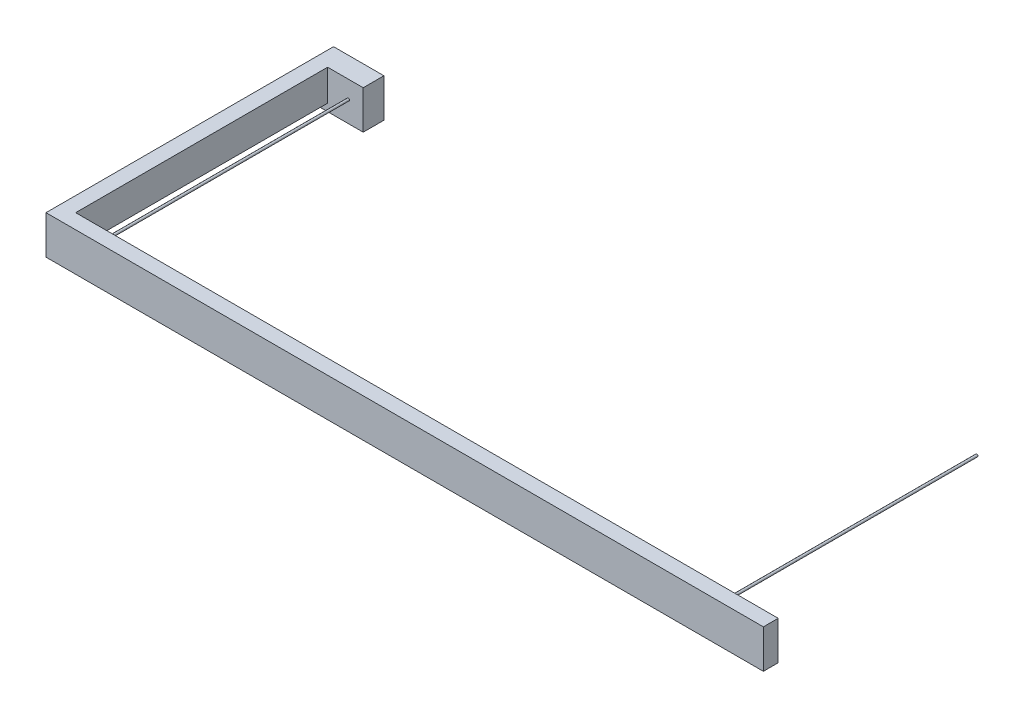
ISO-10303-21;
HEADER;
FILE_DESCRIPTION(('STEP AP214'),'2;1');
FILE_NAME('part.step','',(''),(''),'','','');
FILE_SCHEMA(('AUTOMOTIVE_DESIGN { 1 0 10303 214 1 1 1 1 }'));
ENDSEC;
DATA;
#1=APPLICATION_CONTEXT('core data for automotive mechanical design processes');
#2=APPLICATION_PROTOCOL_DEFINITION('international standard','automotive_design',2000,#1);
#3=PRODUCT_CONTEXT('',#1,'mechanical');
#4=PRODUCT('Part','Part','',(#3));
#5=PRODUCT_RELATED_PRODUCT_CATEGORY('part','',(#4));
#6=PRODUCT_DEFINITION_FORMATION('','',#4);
#7=PRODUCT_DEFINITION_CONTEXT('part definition',#1,'design');
#8=PRODUCT_DEFINITION('design','',#6,#7);
#9=PRODUCT_DEFINITION_SHAPE('','',#8);
#10=(LENGTH_UNIT() NAMED_UNIT(*) SI_UNIT(.MILLI.,.METRE.));
#11=(NAMED_UNIT(*) PLANE_ANGLE_UNIT() SI_UNIT($,.RADIAN.));
#12=(NAMED_UNIT(*) SI_UNIT($,.STERADIAN.) SOLID_ANGLE_UNIT());
#13=UNCERTAINTY_MEASURE_WITH_UNIT(LENGTH_MEASURE(1.E-05),#10,'distance_accuracy_value','');
#14=(GEOMETRIC_REPRESENTATION_CONTEXT(3) GLOBAL_UNCERTAINTY_ASSIGNED_CONTEXT((#13)) GLOBAL_UNIT_ASSIGNED_CONTEXT((#10,
#11,#12)) REPRESENTATION_CONTEXT('',''));
#15=CARTESIAN_POINT('',(0.,0.,0.));
#16=DIRECTION('',(0.,0.,1.));
#17=DIRECTION('',(1.,0.,0.));
#18=AXIS2_PLACEMENT_3D('',#15,#16,#17);
#19=CARTESIAN_POINT('',(0.,0.,5.));
#20=DIRECTION('',(0.,1.,0.));
#21=DIRECTION('',(0.,0.,1.));
#22=AXIS2_PLACEMENT_3D('',#19,#20,#21);
#23=PLANE('',#22);
#24=DIRECTION('',(0.,0.,1.));
#25=VECTOR('',#24,1.);
#26=CARTESIAN_POINT('',(-217.,0.,0.));
#27=LINE('',#26,#25);
#28=CARTESIAN_POINT('',(-217.,0.,0.));
#29=VERTEX_POINT('',#28);
#30=CARTESIAN_POINT('',(-217.,0.,5.));
#31=VERTEX_POINT('',#30);
#32=EDGE_CURVE('E133',#29,#31,#27,.T.);
#33=ORIENTED_EDGE('',*,*,#32,.F.);
#34=DIRECTION('',(1.,0.,0.));
#35=VECTOR('',#34,1.);
#36=CARTESIAN_POINT('',(0.,0.,0.));
#37=LINE('',#36,#35);
#38=CARTESIAN_POINT('',(25.,0.,0.));
#39=VERTEX_POINT('',#38);
#40=EDGE_CURVE('E67',#29,#39,#37,.T.);
#41=ORIENTED_EDGE('',*,*,#40,.T.);
#42=DIRECTION('',(0.,0.,-1.));
#43=VECTOR('',#42,1.);
#44=CARTESIAN_POINT('',(25.,0.,5.));
#45=LINE('',#44,#43);
#46=CARTESIAN_POINT('',(25.,0.,5.));
#47=VERTEX_POINT('',#46);
#48=EDGE_CURVE('E11',#47,#39,#45,.T.);
#49=ORIENTED_EDGE('',*,*,#48,.F.);
#50=DIRECTION('',(1.,0.,0.));
#51=VECTOR('',#50,1.);
#52=CARTESIAN_POINT('',(0.,0.,5.));
#53=LINE('',#52,#51);
#54=EDGE_CURVE('E141',#31,#47,#53,.T.);
#55=ORIENTED_EDGE('',*,*,#54,.F.);
#56=EDGE_LOOP('',(#33,#41,#49,#55));
#57=FACE_BOUND('',#56,.T.);
#58=ADVANCED_FACE('F39',(#57),#23,.F.);
#59=DIRECTION('',(-1.,0.,0.));
#60=VECTOR('',#59,1.);
#61=CARTESIAN_POINT('',(-212.,0.,-85.));
#62=LINE('',#61,#60);
#63=CARTESIAN_POINT('',(-200.,0.,-85.));
#64=VERTEX_POINT('',#63);
#65=CARTESIAN_POINT('',(-217.,0.,-85.));
#66=VERTEX_POINT('',#65);
#67=EDGE_CURVE('E215',#64,#66,#62,.T.);
#68=ORIENTED_EDGE('',*,*,#67,.T.);
#69=CARTESIAN_POINT('',(-217.,0.,-92.));
#70=VERTEX_POINT('',#69);
#71=EDGE_CURVE('E143',#70,#66,#27,.T.);
#72=ORIENTED_EDGE('',*,*,#71,.F.);
#73=DIRECTION('',(-1.,0.,0.));
#74=VECTOR('',#73,1.);
#75=CARTESIAN_POINT('',(-217.,0.,-92.));
#76=LINE('',#75,#74);
#77=CARTESIAN_POINT('',(-200.,0.,-92.));
#78=VERTEX_POINT('',#77);
#79=EDGE_CURVE('E150',#78,#70,#76,.T.);
#80=ORIENTED_EDGE('',*,*,#79,.F.);
#81=DIRECTION('',(0.,0.,1.));
#82=VECTOR('',#81,1.);
#83=CARTESIAN_POINT('',(-200.,0.,-92.));
#84=LINE('',#83,#82);
#85=EDGE_CURVE('E225',#78,#64,#84,.T.);
#86=ORIENTED_EDGE('',*,*,#85,.T.);
#87=EDGE_LOOP('',(#68,#72,#80,#86));
#88=FACE_BOUND('',#87,.T.);
#89=ADVANCED_FACE('F254',(#88),#23,.F.);
#90=CARTESIAN_POINT('',(-217.,0.,0.));
#91=DIRECTION('',(-1.,0.,0.));
#92=DIRECTION('',(0.,0.,1.));
#93=AXIS2_PLACEMENT_3D('',#90,#91,#92);
#94=PLANE('',#93);
#95=DIRECTION('',(0.,0.,1.));
#96=VECTOR('',#95,1.);
#97=CARTESIAN_POINT('',(-217.,4.11300117919977,-98.2871259365778));
#98=LINE('',#97,#96);
#99=CARTESIAN_POINT('',(-217.,4.11300117919977,-85.));
#100=VERTEX_POINT('',#99);
#101=CARTESIAN_POINT('',(-217.,4.11300117919977,0.));
#102=VERTEX_POINT('',#101);
#103=EDGE_CURVE('E137',#100,#102,#98,.T.);
#104=ORIENTED_EDGE('',*,*,#103,.T.);
#105=DIRECTION('',(0.,1.,0.));
#106=VECTOR('',#105,1.);
#107=CARTESIAN_POINT('',(-217.,4.11300117919977,0.));
#108=LINE('',#107,#106);
#109=EDGE_CURVE('E123',#29,#102,#108,.T.);
#110=ORIENTED_EDGE('',*,*,#109,.F.);
#111=ORIENTED_EDGE('',*,*,#32,.T.);
#112=DIRECTION('',(0.,1.,0.));
#113=VECTOR('',#112,1.);
#114=CARTESIAN_POINT('',(-217.,13.,5.));
#115=LINE('',#114,#113);
#116=CARTESIAN_POINT('',(-217.,13.,5.));
#117=VERTEX_POINT('',#116);
#118=EDGE_CURVE('E149',#31,#117,#115,.T.);
#119=ORIENTED_EDGE('',*,*,#118,.T.);
#120=DIRECTION('',(0.,0.,-1.));
#121=VECTOR('',#120,1.);
#122=CARTESIAN_POINT('',(-217.,13.,0.));
#123=LINE('',#122,#121);
#124=CARTESIAN_POINT('',(-217.,13.,-92.));
#125=VERTEX_POINT('',#124);
#126=EDGE_CURVE('E156',#117,#125,#123,.T.);
#127=ORIENTED_EDGE('',*,*,#126,.T.);
#128=DIRECTION('',(0.,1.,0.));
#129=VECTOR('',#128,1.);
#130=CARTESIAN_POINT('',(-217.,13.,-92.));
#131=LINE('',#130,#129);
#132=EDGE_CURVE('E194',#70,#125,#131,.T.);
#133=ORIENTED_EDGE('',*,*,#132,.F.);
#134=ORIENTED_EDGE('',*,*,#71,.T.);
#135=DIRECTION('',(0.,-1.,0.));
#136=VECTOR('',#135,1.);
#137=CARTESIAN_POINT('',(-217.,4.11300117919977,-85.));
#138=LINE('',#137,#136);
#139=EDGE_CURVE('E237',#100,#66,#138,.T.);
#140=ORIENTED_EDGE('',*,*,#139,.F.);
#141=EDGE_LOOP('',(#104,#110,#111,#119,#127,#133,#134,#140));
#142=FACE_BOUND('',#141,.T.);
#143=ADVANCED_FACE('F132',(#142),#94,.T.);
#144=CARTESIAN_POINT('',(-212.,13.,-92.));
#145=DIRECTION('',(-1.,0.,0.));
#146=DIRECTION('',(0.,0.,1.));
#147=AXIS2_PLACEMENT_3D('',#144,#145,#146);
#148=PLANE('',#147);
#149=DIRECTION('',(0.,0.,1.));
#150=VECTOR('',#149,1.);
#151=CARTESIAN_POINT('',(-212.,2.48531638254829,-92.));
#152=LINE('',#151,#150);
#153=CARTESIAN_POINT('',(-212.,2.48531638254829,-85.));
#154=VERTEX_POINT('',#153);
#155=CARTESIAN_POINT('',(-212.,2.48531638254829,0.));
#156=VERTEX_POINT('',#155);
#157=EDGE_CURVE('E229',#154,#156,#152,.T.);
#158=ORIENTED_EDGE('',*,*,#157,.F.);
#159=DIRECTION('',(0.,-1.,0.));
#160=VECTOR('',#159,1.);
#161=CARTESIAN_POINT('',(-212.,26.8924439894498,-85.));
#162=LINE('',#161,#160);
#163=CARTESIAN_POINT('',(-212.,13.,-85.));
#164=VERTEX_POINT('',#163);
#165=EDGE_CURVE('E218',#164,#154,#162,.T.);
#166=ORIENTED_EDGE('',*,*,#165,.F.);
#167=DIRECTION('',(0.,0.,1.));
#168=VECTOR('',#167,1.);
#169=CARTESIAN_POINT('',(-212.,13.,-92.));
#170=LINE('',#169,#168);
#171=CARTESIAN_POINT('',(-212.,13.,0.));
#172=VERTEX_POINT('',#171);
#173=EDGE_CURVE('E144',#164,#172,#170,.T.);
#174=ORIENTED_EDGE('',*,*,#173,.T.);
#175=DIRECTION('',(0.,-1.,0.));
#176=VECTOR('',#175,1.);
#177=CARTESIAN_POINT('',(-212.,13.,0.));
#178=LINE('',#177,#176);
#179=EDGE_CURVE('E190',#172,#156,#178,.T.);
#180=ORIENTED_EDGE('',*,*,#179,.T.);
#181=EDGE_LOOP('',(#158,#166,#174,#180));
#182=FACE_BOUND('',#181,.T.);
#183=ADVANCED_FACE('F264',(#182),#148,.F.);
#184=CARTESIAN_POINT('',(0.,0.,0.));
#185=DIRECTION('',(0.,0.,-1.));
#186=DIRECTION('',(-1.,0.,0.));
#187=AXIS2_PLACEMENT_3D('',#184,#185,#186);
#188=PLANE('',#187);
#189=DIRECTION('',(0.950883869155892,-0.309547843441235,0.));
#190=VECTOR('',#189,1.);
#191=CARTESIAN_POINT('',(-204.365486279465,0.,0.));
#192=LINE('',#191,#190);
#193=EDGE_CURVE('E139',#102,#156,#192,.T.);
#194=ORIENTED_EDGE('',*,*,#193,.T.);
#195=ORIENTED_EDGE('',*,*,#179,.F.);
#196=DIRECTION('',(-1.,0.,0.));
#197=VECTOR('',#196,1.);
#198=CARTESIAN_POINT('',(0.,13.,0.));
#199=LINE('',#198,#197);
#200=CARTESIAN_POINT('',(25.,13.,0.));
#201=VERTEX_POINT('',#200);
#202=EDGE_CURVE('E172',#201,#172,#199,.T.);
#203=ORIENTED_EDGE('',*,*,#202,.F.);
#204=DIRECTION('',(0.,1.,0.));
#205=VECTOR('',#204,1.);
#206=CARTESIAN_POINT('',(25.,0.,0.));
#207=LINE('',#206,#205);
#208=EDGE_CURVE('E126',#39,#201,#207,.T.);
#209=ORIENTED_EDGE('',*,*,#208,.F.);
#210=ORIENTED_EDGE('',*,*,#40,.F.);
#211=ORIENTED_EDGE('',*,*,#109,.T.);
#212=EDGE_LOOP('',(#194,#195,#203,#209,#210,#211));
#213=FACE_BOUND('',#212,.T.);
#214=CARTESIAN_POINT('',(-205.,7.1,0.));
#215=DIRECTION('',(0.,0.,-1.));
#216=DIRECTION('',(-1.,0.,0.));
#217=AXIS2_PLACEMENT_3D('',#214,#215,#216);
#218=CIRCLE('',#217,0.400000000000006);
#219=CARTESIAN_POINT('',(-205.4,7.1,0.));
#220=VERTEX_POINT('',#219);
#221=EDGE_CURVE('E159',#220,#220,#218,.T.);
#222=ORIENTED_EDGE('',*,*,#221,.F.);
#223=EDGE_LOOP('',(#222));
#224=FACE_BOUND('',#223,.T.);
#225=CARTESIAN_POINT('',(5.,7.1,0.));
#226=DIRECTION('',(0.,0.,-1.));
#227=DIRECTION('',(-1.,0.,0.));
#228=AXIS2_PLACEMENT_3D('',#225,#226,#227);
#229=CIRCLE('',#228,0.400000000000001);
#230=CARTESIAN_POINT('',(4.6,7.1,0.));
#231=VERTEX_POINT('',#230);
#232=EDGE_CURVE('E163',#231,#231,#229,.T.);
#233=ORIENTED_EDGE('',*,*,#232,.F.);
#234=EDGE_LOOP('',(#233));
#235=FACE_BOUND('',#234,.T.);
#236=ADVANCED_FACE('F121',(#213,#224,#235),#188,.T.);
#237=CARTESIAN_POINT('',(25.,0.,5.));
#238=DIRECTION('',(-1.,0.,0.));
#239=DIRECTION('',(0.,0.,1.));
#240=AXIS2_PLACEMENT_3D('',#237,#238,#239);
#241=PLANE('',#240);
#242=ORIENTED_EDGE('',*,*,#208,.T.);
#243=DIRECTION('',(0.,0.,-1.));
#244=VECTOR('',#243,1.);
#245=CARTESIAN_POINT('',(25.,13.,5.));
#246=LINE('',#245,#244);
#247=CARTESIAN_POINT('',(25.,13.,5.));
#248=VERTEX_POINT('',#247);
#249=EDGE_CURVE('E48',#248,#201,#246,.T.);
#250=ORIENTED_EDGE('',*,*,#249,.F.);
#251=DIRECTION('',(0.,1.,0.));
#252=VECTOR('',#251,1.);
#253=CARTESIAN_POINT('',(25.,0.,5.));
#254=LINE('',#253,#252);
#255=EDGE_CURVE('E56',#47,#248,#254,.T.);
#256=ORIENTED_EDGE('',*,*,#255,.F.);
#257=ORIENTED_EDGE('',*,*,#48,.T.);
#258=EDGE_LOOP('',(#242,#250,#256,#257));
#259=FACE_BOUND('',#258,.T.);
#260=ADVANCED_FACE('F306',(#259),#241,.F.);
#261=CARTESIAN_POINT('',(0.,13.,5.));
#262=DIRECTION('',(0.,-1.,0.));
#263=DIRECTION('',(0.,0.,-1.));
#264=AXIS2_PLACEMENT_3D('',#261,#262,#263);
#265=PLANE('',#264);
#266=ORIENTED_EDGE('',*,*,#202,.T.);
#267=ORIENTED_EDGE('',*,*,#173,.F.);
#268=DIRECTION('',(1.,0.,0.));
#269=VECTOR('',#268,1.);
#270=CARTESIAN_POINT('',(-212.,13.,-85.));
#271=LINE('',#270,#269);
#272=CARTESIAN_POINT('',(-200.,13.,-85.));
#273=VERTEX_POINT('',#272);
#274=EDGE_CURVE('E202',#164,#273,#271,.T.);
#275=ORIENTED_EDGE('',*,*,#274,.T.);
#276=DIRECTION('',(0.,0.,-1.));
#277=VECTOR('',#276,1.);
#278=CARTESIAN_POINT('',(-200.,13.,-92.));
#279=LINE('',#278,#277);
#280=CARTESIAN_POINT('',(-200.,13.,-92.));
#281=VERTEX_POINT('',#280);
#282=EDGE_CURVE('E222',#273,#281,#279,.T.);
#283=ORIENTED_EDGE('',*,*,#282,.T.);
#284=DIRECTION('',(1.,0.,0.));
#285=VECTOR('',#284,1.);
#286=CARTESIAN_POINT('',(-217.,13.,-92.));
#287=LINE('',#286,#285);
#288=EDGE_CURVE('E199',#125,#281,#287,.T.);
#289=ORIENTED_EDGE('',*,*,#288,.F.);
#290=ORIENTED_EDGE('',*,*,#126,.F.);
#291=DIRECTION('',(-1.,0.,0.));
#292=VECTOR('',#291,1.);
#293=CARTESIAN_POINT('',(0.,13.,5.));
#294=LINE('',#293,#292);
#295=EDGE_CURVE('E72',#248,#117,#294,.T.);
#296=ORIENTED_EDGE('',*,*,#295,.F.);
#297=ORIENTED_EDGE('',*,*,#249,.T.);
#298=EDGE_LOOP('',(#266,#267,#275,#283,#289,#290,#296,#297));
#299=FACE_BOUND('',#298,.T.);
#300=ADVANCED_FACE('F184',(#299),#265,.F.);
#301=CARTESIAN_POINT('',(0.,0.,5.));
#302=DIRECTION('',(0.,0.,-1.));
#303=DIRECTION('',(-1.,0.,0.));
#304=AXIS2_PLACEMENT_3D('',#301,#302,#303);
#305=PLANE('',#304);
#306=ORIENTED_EDGE('',*,*,#295,.T.);
#307=ORIENTED_EDGE('',*,*,#118,.F.);
#308=ORIENTED_EDGE('',*,*,#54,.T.);
#309=ORIENTED_EDGE('',*,*,#255,.T.);
#310=EDGE_LOOP('',(#306,#307,#308,#309));
#311=FACE_BOUND('',#310,.T.);
#312=ADVANCED_FACE('F300',(#311),#305,.F.);
#313=CARTESIAN_POINT('',(5.,7.1,-87.));
#314=DIRECTION('',(0.,0.,1.));
#315=DIRECTION('',(1.,0.,0.));
#316=AXIS2_PLACEMENT_3D('',#313,#314,#315);
#317=CYLINDRICAL_SURFACE('',#316,0.400000000000001);
#318=CARTESIAN_POINT('',(5.,7.1,-87.));
#319=DIRECTION('',(0.,0.,-1.));
#320=DIRECTION('',(-1.,0.,0.));
#321=AXIS2_PLACEMENT_3D('',#318,#319,#320);
#322=CIRCLE('',#321,0.400000000000001);
#323=CARTESIAN_POINT('',(4.6,7.1,-87.));
#324=VERTEX_POINT('',#323);
#325=EDGE_CURVE('E128',#324,#324,#322,.T.);
#326=ORIENTED_EDGE('',*,*,#325,.F.);
#327=EDGE_LOOP('',(#326));
#328=FACE_BOUND('',#327,.T.);
#329=ORIENTED_EDGE('',*,*,#232,.T.);
#330=EDGE_LOOP('',(#329));
#331=FACE_BOUND('',#330,.T.);
#332=ADVANCED_FACE('F296',(#328,#331),#317,.T.);
#333=CARTESIAN_POINT('',(5.,7.1,-87.));
#334=DIRECTION('',(0.,0.,-1.));
#335=DIRECTION('',(-1.,0.,0.));
#336=AXIS2_PLACEMENT_3D('',#333,#334,#335);
#337=PLANE('',#336);
#338=ORIENTED_EDGE('',*,*,#325,.T.);
#339=EDGE_LOOP('',(#338));
#340=FACE_BOUND('',#339,.T.);
#341=ADVANCED_FACE('F292',(#340),#337,.T.);
#342=CARTESIAN_POINT('',(-205.,7.1,-87.));
#343=DIRECTION('',(0.,0.,1.));
#344=DIRECTION('',(1.,0.,0.));
#345=AXIS2_PLACEMENT_3D('',#342,#343,#344);
#346=CYLINDRICAL_SURFACE('',#345,0.400000000000006);
#347=CARTESIAN_POINT('',(-205.,7.1,-85.));
#348=DIRECTION('',(0.,0.,1.));
#349=DIRECTION('',(1.,0.,0.));
#350=AXIS2_PLACEMENT_3D('',#347,#348,#349);
#351=CIRCLE('',#350,0.400000000000006);
#352=CARTESIAN_POINT('',(-204.6,7.1,-85.));
#353=VERTEX_POINT('',#352);
#354=EDGE_CURVE('E195',#353,#353,#351,.T.);
#355=ORIENTED_EDGE('',*,*,#354,.T.);
#356=EDGE_LOOP('',(#355));
#357=FACE_BOUND('',#356,.T.);
#358=ORIENTED_EDGE('',*,*,#221,.T.);
#359=EDGE_LOOP('',(#358));
#360=FACE_BOUND('',#359,.T.);
#361=ADVANCED_FACE('F289',(#357,#360),#346,.T.);
#362=CARTESIAN_POINT('',(0.,0.,-92.));
#363=DIRECTION('',(0.,0.,1.));
#364=DIRECTION('',(1.,0.,0.));
#365=AXIS2_PLACEMENT_3D('',#362,#363,#364);
#366=PLANE('',#365);
#367=ORIENTED_EDGE('',*,*,#132,.T.);
#368=ORIENTED_EDGE('',*,*,#288,.T.);
#369=DIRECTION('',(0.,-1.,0.));
#370=VECTOR('',#369,1.);
#371=CARTESIAN_POINT('',(-200.,26.8924439894498,-92.));
#372=LINE('',#371,#370);
#373=EDGE_CURVE('E210',#281,#78,#372,.T.);
#374=ORIENTED_EDGE('',*,*,#373,.T.);
#375=ORIENTED_EDGE('',*,*,#79,.T.);
#376=EDGE_LOOP('',(#367,#368,#374,#375));
#377=FACE_BOUND('',#376,.T.);
#378=ADVANCED_FACE('F256',(#377),#366,.F.);
#379=CARTESIAN_POINT('',(-212.,26.8924439894498,-85.));
#380=DIRECTION('',(0.,0.,1.));
#381=DIRECTION('',(1.,0.,0.));
#382=AXIS2_PLACEMENT_3D('',#379,#380,#381);
#383=PLANE('',#382);
#384=ORIENTED_EDGE('',*,*,#139,.T.);
#385=ORIENTED_EDGE('',*,*,#67,.F.);
#386=DIRECTION('',(0.,-1.,0.));
#387=VECTOR('',#386,1.);
#388=CARTESIAN_POINT('',(-200.,26.8924439894498,-85.));
#389=LINE('',#388,#387);
#390=EDGE_CURVE('E214',#273,#64,#389,.T.);
#391=ORIENTED_EDGE('',*,*,#390,.F.);
#392=ORIENTED_EDGE('',*,*,#274,.F.);
#393=ORIENTED_EDGE('',*,*,#165,.T.);
#394=DIRECTION('',(-0.950883869155893,0.309547843441235,0.));
#395=VECTOR('',#394,1.);
#396=CARTESIAN_POINT('',(-204.365486279465,0.,-85.));
#397=LINE('',#396,#395);
#398=EDGE_CURVE('E238',#154,#100,#397,.T.);
#399=ORIENTED_EDGE('',*,*,#398,.T.);
#400=EDGE_LOOP('',(#384,#385,#391,#392,#393,#399));
#401=FACE_BOUND('',#400,.T.);
#402=ORIENTED_EDGE('',*,*,#354,.F.);
#403=EDGE_LOOP('',(#402));
#404=FACE_BOUND('',#403,.T.);
#405=ADVANCED_FACE('F249',(#401,#404),#383,.T.);
#406=CARTESIAN_POINT('',(-200.,26.8924439894498,-92.));
#407=DIRECTION('',(1.,0.,0.));
#408=DIRECTION('',(0.,0.,-1.));
#409=AXIS2_PLACEMENT_3D('',#406,#407,#408);
#410=PLANE('',#409);
#411=ORIENTED_EDGE('',*,*,#282,.F.);
#412=ORIENTED_EDGE('',*,*,#390,.T.);
#413=ORIENTED_EDGE('',*,*,#85,.F.);
#414=ORIENTED_EDGE('',*,*,#373,.F.);
#415=EDGE_LOOP('',(#411,#412,#413,#414));
#416=FACE_BOUND('',#415,.T.);
#417=ADVANCED_FACE('F262',(#416),#410,.T.);
#418=CARTESIAN_POINT('',(-204.365486279465,0.,-98.2871259365778));
#419=DIRECTION('',(-0.309547843441235,-0.950883869155893,0.));
#420=DIRECTION('',(0.950883869155893,-0.309547843441235,0.));
#421=AXIS2_PLACEMENT_3D('',#418,#419,#420);
#422=PLANE('',#421);
#423=ORIENTED_EDGE('',*,*,#157,.T.);
#424=ORIENTED_EDGE('',*,*,#193,.F.);
#425=ORIENTED_EDGE('',*,*,#103,.F.);
#426=ORIENTED_EDGE('',*,*,#398,.F.);
#427=EDGE_LOOP('',(#423,#424,#425,#426));
#428=FACE_BOUND('',#427,.T.);
#429=ADVANCED_FACE('F266',(#428),#422,.T.);
#430=CLOSED_SHELL('',(#58,#89,#143,#183,#236,#260,#300,#312,#332,#341,#361,#378,#405,#417,#429));
#431=MANIFOLD_SOLID_BREP('B2',#430);
#432=ADVANCED_BREP_SHAPE_REPRESENTATION('',(#18,#431),#14);
#433=SHAPE_DEFINITION_REPRESENTATION(#9,#432);
ENDSEC;
END-ISO-10303-21;
